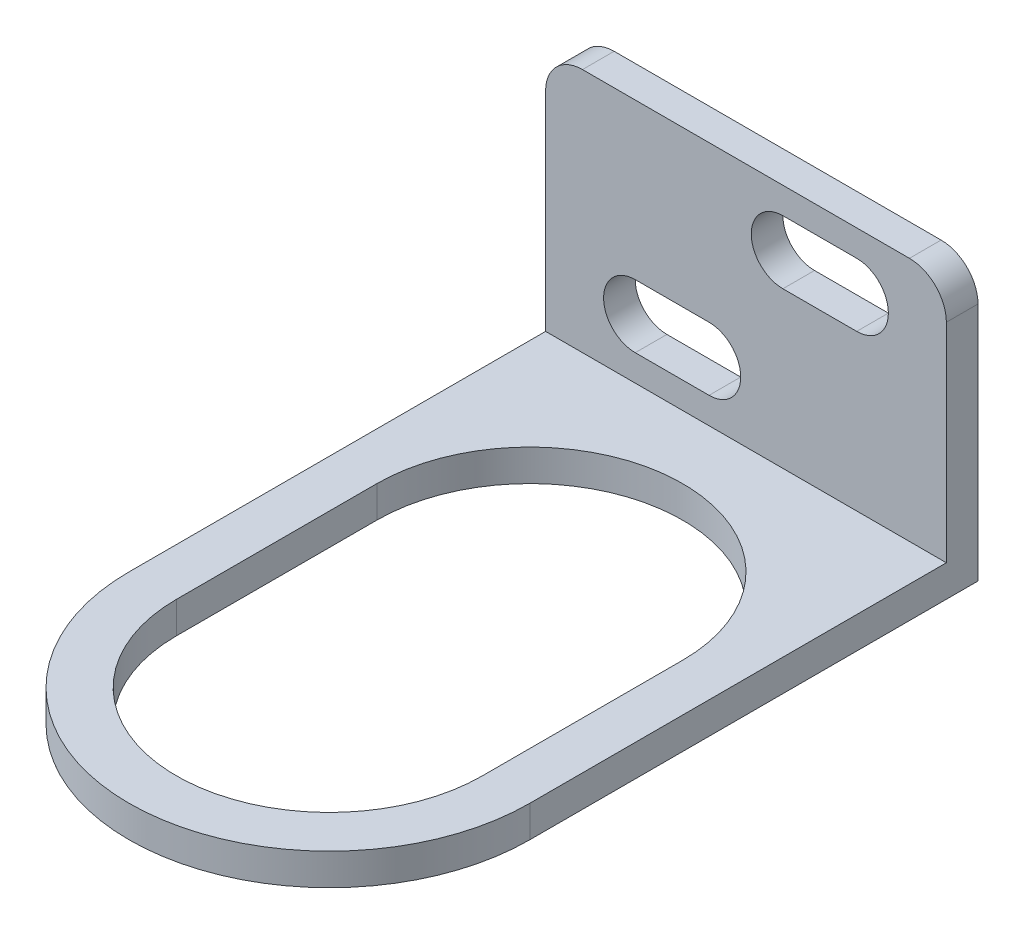
ISO-10303-21;
HEADER;
FILE_DESCRIPTION(('STEP AP214'),'2;1');
FILE_NAME('part.step','',(''),(''),'','','');
FILE_SCHEMA(('AUTOMOTIVE_DESIGN { 1 0 10303 214 1 1 1 1 }'));
ENDSEC;
DATA;
#1=APPLICATION_CONTEXT('core data for automotive mechanical design processes');
#2=APPLICATION_PROTOCOL_DEFINITION('international standard','automotive_design',2000,#1);
#3=PRODUCT_CONTEXT('',#1,'mechanical');
#4=PRODUCT('Part','Part','',(#3));
#5=PRODUCT_RELATED_PRODUCT_CATEGORY('part','',(#4));
#6=PRODUCT_DEFINITION_FORMATION('','',#4);
#7=PRODUCT_DEFINITION_CONTEXT('part definition',#1,'design');
#8=PRODUCT_DEFINITION('design','',#6,#7);
#9=PRODUCT_DEFINITION_SHAPE('','',#8);
#10=(LENGTH_UNIT() NAMED_UNIT(*) SI_UNIT(.MILLI.,.METRE.));
#11=(NAMED_UNIT(*) PLANE_ANGLE_UNIT() SI_UNIT($,.RADIAN.));
#12=(NAMED_UNIT(*) SI_UNIT($,.STERADIAN.) SOLID_ANGLE_UNIT());
#13=UNCERTAINTY_MEASURE_WITH_UNIT(LENGTH_MEASURE(1.E-05),#10,'distance_accuracy_value','');
#14=(GEOMETRIC_REPRESENTATION_CONTEXT(3) GLOBAL_UNCERTAINTY_ASSIGNED_CONTEXT((#13)) GLOBAL_UNIT_ASSIGNED_CONTEXT((#10,
#11,#12)) REPRESENTATION_CONTEXT('',''));
#15=CARTESIAN_POINT('',(0.,0.,0.));
#16=DIRECTION('',(0.,0.,1.));
#17=DIRECTION('',(1.,0.,0.));
#18=AXIS2_PLACEMENT_3D('',#15,#16,#17);
#19=CARTESIAN_POINT('',(-38.,0.,63.));
#20=DIRECTION('',(0.,-1.,0.));
#21=DIRECTION('',(0.,0.,-1.));
#22=AXIS2_PLACEMENT_3D('',#19,#20,#21);
#23=PLANE('',#22);
#24=DIRECTION('',(0.,0.,1.));
#25=VECTOR('',#24,1.);
#26=CARTESIAN_POINT('',(-33.5,0.,0.));
#27=LINE('',#26,#25);
#28=CARTESIAN_POINT('',(-33.5,0.,23.5));
#29=VERTEX_POINT('',#28);
#30=CARTESIAN_POINT('',(-33.5,0.,42.5));
#31=VERTEX_POINT('',#30);
#32=EDGE_CURVE('E348',#29,#31,#27,.T.);
#33=ORIENTED_EDGE('',*,*,#32,.T.);
#34=CARTESIAN_POINT('',(-19.,0.,42.5));
#35=DIRECTION('',(0.,1.,0.));
#36=DIRECTION('',(0.,0.,1.));
#37=AXIS2_PLACEMENT_3D('',#34,#35,#36);
#38=CIRCLE('',#37,14.5);
#39=CARTESIAN_POINT('',(-4.5,0.,42.5));
#40=VERTEX_POINT('',#39);
#41=EDGE_CURVE('E360',#31,#40,#38,.T.);
#42=ORIENTED_EDGE('',*,*,#41,.T.);
#43=DIRECTION('',(0.,0.,1.));
#44=VECTOR('',#43,1.);
#45=CARTESIAN_POINT('',(-4.5,0.,0.));
#46=LINE('',#45,#44);
#47=CARTESIAN_POINT('',(-4.5,0.,23.5));
#48=VERTEX_POINT('',#47);
#49=EDGE_CURVE('E358',#48,#40,#46,.T.);
#50=ORIENTED_EDGE('',*,*,#49,.F.);
#51=CARTESIAN_POINT('',(-19.,0.,23.5));
#52=DIRECTION('',(0.,1.,0.));
#53=DIRECTION('',(0.,0.,1.));
#54=AXIS2_PLACEMENT_3D('',#51,#52,#53);
#55=CIRCLE('',#54,14.5);
#56=EDGE_CURVE('E340',#48,#29,#55,.T.);
#57=ORIENTED_EDGE('',*,*,#56,.T.);
#58=EDGE_LOOP('',(#33,#42,#50,#57));
#59=FACE_BOUND('',#58,.T.);
#60=DIRECTION('',(0.,0.,-1.));
#61=VECTOR('',#60,1.);
#62=CARTESIAN_POINT('',(0.,0.,63.));
#63=LINE('',#62,#61);
#64=CARTESIAN_POINT('',(0.,0.,42.5));
#65=VERTEX_POINT('',#64);
#66=CARTESIAN_POINT('',(0.,0.,0.));
#67=VERTEX_POINT('',#66);
#68=EDGE_CURVE('E206',#65,#67,#63,.T.);
#69=ORIENTED_EDGE('',*,*,#68,.F.);
#70=CARTESIAN_POINT('',(-19.,0.,42.5));
#71=DIRECTION('',(0.,1.,0.));
#72=DIRECTION('',(0.,0.,1.));
#73=AXIS2_PLACEMENT_3D('',#70,#71,#72);
#74=CIRCLE('',#73,19.);
#75=CARTESIAN_POINT('',(-38.,0.,42.5));
#76=VERTEX_POINT('',#75);
#77=EDGE_CURVE('E72',#76,#65,#74,.T.);
#78=ORIENTED_EDGE('',*,*,#77,.F.);
#79=DIRECTION('',(0.,0.,-1.));
#80=VECTOR('',#79,1.);
#81=CARTESIAN_POINT('',(-38.,0.,63.));
#82=LINE('',#81,#80);
#83=CARTESIAN_POINT('',(-38.,0.,0.));
#84=VERTEX_POINT('',#83);
#85=EDGE_CURVE('E204',#76,#84,#82,.T.);
#86=ORIENTED_EDGE('',*,*,#85,.T.);
#87=DIRECTION('',(1.,0.,0.));
#88=VECTOR('',#87,1.);
#89=CARTESIAN_POINT('',(-38.,0.,0.));
#90=LINE('',#89,#88);
#91=EDGE_CURVE('E233',#84,#67,#90,.T.);
#92=ORIENTED_EDGE('',*,*,#91,.T.);
#93=EDGE_LOOP('',(#69,#78,#86,#92));
#94=FACE_BOUND('',#93,.T.);
#95=ADVANCED_FACE('F57',(#59,#94),#23,.T.);
#96=CARTESIAN_POINT('',(-38.,3.,63.));
#97=DIRECTION('',(0.,-1.,0.));
#98=DIRECTION('',(0.,0.,-1.));
#99=AXIS2_PLACEMENT_3D('',#96,#97,#98);
#100=PLANE('',#99);
#101=CARTESIAN_POINT('',(-19.,3.,42.5));
#102=DIRECTION('',(0.,1.,0.));
#103=DIRECTION('',(0.,0.,1.));
#104=AXIS2_PLACEMENT_3D('',#101,#102,#103);
#105=CIRCLE('',#104,14.5);
#106=CARTESIAN_POINT('',(-33.5,3.,42.5));
#107=VERTEX_POINT('',#106);
#108=CARTESIAN_POINT('',(-4.5,3.,42.5));
#109=VERTEX_POINT('',#108);
#110=EDGE_CURVE('E352',#107,#109,#105,.T.);
#111=ORIENTED_EDGE('',*,*,#110,.F.);
#112=DIRECTION('',(0.,0.,1.));
#113=VECTOR('',#112,1.);
#114=CARTESIAN_POINT('',(-33.5,3.,0.));
#115=LINE('',#114,#113);
#116=CARTESIAN_POINT('',(-33.5,3.,23.5));
#117=VERTEX_POINT('',#116);
#118=EDGE_CURVE('E354',#117,#107,#115,.T.);
#119=ORIENTED_EDGE('',*,*,#118,.F.);
#120=CARTESIAN_POINT('',(-19.,3.,23.5));
#121=DIRECTION('',(0.,1.,0.));
#122=DIRECTION('',(0.,0.,1.));
#123=AXIS2_PLACEMENT_3D('',#120,#121,#122);
#124=CIRCLE('',#123,14.5);
#125=CARTESIAN_POINT('',(-4.5,3.,23.5));
#126=VERTEX_POINT('',#125);
#127=EDGE_CURVE('E345',#126,#117,#124,.T.);
#128=ORIENTED_EDGE('',*,*,#127,.F.);
#129=DIRECTION('',(0.,0.,1.));
#130=VECTOR('',#129,1.);
#131=CARTESIAN_POINT('',(-4.5,3.,0.));
#132=LINE('',#131,#130);
#133=EDGE_CURVE('E349',#126,#109,#132,.T.);
#134=ORIENTED_EDGE('',*,*,#133,.T.);
#135=EDGE_LOOP('',(#111,#119,#128,#134));
#136=FACE_BOUND('',#135,.T.);
#137=CARTESIAN_POINT('',(-19.,3.,42.5));
#138=DIRECTION('',(0.,1.,0.));
#139=DIRECTION('',(0.,0.,1.));
#140=AXIS2_PLACEMENT_3D('',#137,#138,#139);
#141=CIRCLE('',#140,19.);
#142=CARTESIAN_POINT('',(-38.,3.,42.5));
#143=VERTEX_POINT('',#142);
#144=CARTESIAN_POINT('',(0.,3.,42.5));
#145=VERTEX_POINT('',#144);
#146=EDGE_CURVE('E195',#143,#145,#141,.T.);
#147=ORIENTED_EDGE('',*,*,#146,.T.);
#148=DIRECTION('',(0.,0.,-1.));
#149=VECTOR('',#148,1.);
#150=CARTESIAN_POINT('',(0.,3.,63.));
#151=LINE('',#150,#149);
#152=CARTESIAN_POINT('',(0.,3.,3.));
#153=VERTEX_POINT('',#152);
#154=EDGE_CURVE('E230',#145,#153,#151,.T.);
#155=ORIENTED_EDGE('',*,*,#154,.T.);
#156=DIRECTION('',(1.,0.,0.));
#157=VECTOR('',#156,1.);
#158=CARTESIAN_POINT('',(-38.,3.,3.));
#159=LINE('',#158,#157);
#160=CARTESIAN_POINT('',(-38.,3.,3.));
#161=VERTEX_POINT('',#160);
#162=EDGE_CURVE('E236',#161,#153,#159,.T.);
#163=ORIENTED_EDGE('',*,*,#162,.F.);
#164=DIRECTION('',(0.,0.,-1.));
#165=VECTOR('',#164,1.);
#166=CARTESIAN_POINT('',(-38.,3.,63.));
#167=LINE('',#166,#165);
#168=EDGE_CURVE('E214',#143,#161,#167,.T.);
#169=ORIENTED_EDGE('',*,*,#168,.F.);
#170=EDGE_LOOP('',(#147,#155,#163,#169));
#171=FACE_BOUND('',#170,.T.);
#172=ADVANCED_FACE('F368',(#136,#171),#100,.F.);
#173=CARTESIAN_POINT('',(-38.,0.,0.));
#174=DIRECTION('',(-1.,0.,0.));
#175=DIRECTION('',(0.,0.,1.));
#176=AXIS2_PLACEMENT_3D('',#173,#174,#175);
#177=PLANE('',#176);
#178=ORIENTED_EDGE('',*,*,#85,.F.);
#179=DIRECTION('',(0.,1.,0.));
#180=VECTOR('',#179,1.);
#181=CARTESIAN_POINT('',(-38.,0.,42.5));
#182=LINE('',#181,#180);
#183=EDGE_CURVE('E192',#76,#143,#182,.T.);
#184=ORIENTED_EDGE('',*,*,#183,.T.);
#185=ORIENTED_EDGE('',*,*,#168,.T.);
#186=DIRECTION('',(0.,1.,0.));
#187=VECTOR('',#186,1.);
#188=CARTESIAN_POINT('',(-38.,0.,3.));
#189=LINE('',#188,#187);
#190=CARTESIAN_POINT('',(-38.,22.75,3.));
#191=VERTEX_POINT('',#190);
#192=EDGE_CURVE('E219',#161,#191,#189,.T.);
#193=ORIENTED_EDGE('',*,*,#192,.T.);
#194=DIRECTION('',(0.,0.,-1.));
#195=VECTOR('',#194,1.);
#196=CARTESIAN_POINT('',(-38.,22.75,0.));
#197=LINE('',#196,#195);
#198=CARTESIAN_POINT('',(-38.,22.75,0.));
#199=VERTEX_POINT('',#198);
#200=EDGE_CURVE('E235',#191,#199,#197,.T.);
#201=ORIENTED_EDGE('',*,*,#200,.T.);
#202=DIRECTION('',(0.,1.,0.));
#203=VECTOR('',#202,1.);
#204=CARTESIAN_POINT('',(-38.,0.,0.));
#205=LINE('',#204,#203);
#206=EDGE_CURVE('E212',#84,#199,#205,.T.);
#207=ORIENTED_EDGE('',*,*,#206,.F.);
#208=EDGE_LOOP('',(#178,#184,#185,#193,#201,#207));
#209=FACE_BOUND('',#208,.T.);
#210=ADVANCED_FACE('F209',(#209),#177,.T.);
#211=CARTESIAN_POINT('',(0.,0.,0.));
#212=DIRECTION('',(-1.,0.,0.));
#213=DIRECTION('',(0.,0.,1.));
#214=AXIS2_PLACEMENT_3D('',#211,#212,#213);
#215=PLANE('',#214);
#216=DIRECTION('',(0.,1.,0.));
#217=VECTOR('',#216,1.);
#218=CARTESIAN_POINT('',(0.,0.,42.5));
#219=LINE('',#218,#217);
#220=EDGE_CURVE('E199',#65,#145,#219,.T.);
#221=ORIENTED_EDGE('',*,*,#220,.F.);
#222=ORIENTED_EDGE('',*,*,#68,.T.);
#223=DIRECTION('',(0.,1.,0.));
#224=VECTOR('',#223,1.);
#225=CARTESIAN_POINT('',(0.,0.,0.));
#226=LINE('',#225,#224);
#227=CARTESIAN_POINT('',(0.,22.75,0.));
#228=VERTEX_POINT('',#227);
#229=EDGE_CURVE('E223',#67,#228,#226,.T.);
#230=ORIENTED_EDGE('',*,*,#229,.T.);
#231=DIRECTION('',(0.,0.,-1.));
#232=VECTOR('',#231,1.);
#233=CARTESIAN_POINT('',(0.,22.75,0.));
#234=LINE('',#233,#232);
#235=CARTESIAN_POINT('',(0.,22.75,3.));
#236=VERTEX_POINT('',#235);
#237=EDGE_CURVE('E252',#228,#236,#234,.F.);
#238=ORIENTED_EDGE('',*,*,#237,.T.);
#239=DIRECTION('',(0.,1.,0.));
#240=VECTOR('',#239,1.);
#241=CARTESIAN_POINT('',(0.,0.,3.));
#242=LINE('',#241,#240);
#243=EDGE_CURVE('E226',#153,#236,#242,.T.);
#244=ORIENTED_EDGE('',*,*,#243,.F.);
#245=ORIENTED_EDGE('',*,*,#154,.F.);
#246=EDGE_LOOP('',(#221,#222,#230,#238,#244,#245));
#247=FACE_BOUND('',#246,.T.);
#248=ADVANCED_FACE('F370',(#247),#215,.F.);
#249=CARTESIAN_POINT('',(-3.5,22.75,3.));
#250=DIRECTION('',(0.,0.,-1.));
#251=DIRECTION('',(-1.,0.,0.));
#252=AXIS2_PLACEMENT_3D('',#249,#250,#251);
#253=CYLINDRICAL_SURFACE('',#252,3.5);
#254=DIRECTION('',(0.,0.,-1.));
#255=VECTOR('',#254,1.);
#256=CARTESIAN_POINT('',(-3.5,26.25,3.));
#257=LINE('',#256,#255);
#258=CARTESIAN_POINT('',(-3.5,26.25,3.));
#259=VERTEX_POINT('',#258);
#260=CARTESIAN_POINT('',(-3.5,26.25,0.));
#261=VERTEX_POINT('',#260);
#262=EDGE_CURVE('E249',#259,#261,#257,.T.);
#263=ORIENTED_EDGE('',*,*,#262,.F.);
#264=CARTESIAN_POINT('',(-3.5,22.75,3.));
#265=DIRECTION('',(0.,0.,-1.));
#266=DIRECTION('',(-1.,0.,0.));
#267=AXIS2_PLACEMENT_3D('',#264,#265,#266);
#268=CIRCLE('',#267,3.5);
#269=EDGE_CURVE('E65',#236,#259,#268,.F.);
#270=ORIENTED_EDGE('',*,*,#269,.F.);
#271=ORIENTED_EDGE('',*,*,#237,.F.);
#272=CARTESIAN_POINT('',(-3.5,22.75,0.));
#273=DIRECTION('',(0.,0.,-1.));
#274=DIRECTION('',(-1.,0.,0.));
#275=AXIS2_PLACEMENT_3D('',#272,#273,#274);
#276=CIRCLE('',#275,3.5);
#277=EDGE_CURVE('E12',#261,#228,#276,.T.);
#278=ORIENTED_EDGE('',*,*,#277,.F.);
#279=EDGE_LOOP('',(#263,#270,#271,#278));
#280=FACE_BOUND('',#279,.T.);
#281=ADVANCED_FACE('F59',(#280),#253,.T.);
#282=CARTESIAN_POINT('',(-34.5,22.75,0.));
#283=DIRECTION('',(0.,0.,1.));
#284=DIRECTION('',(1.,0.,0.));
#285=AXIS2_PLACEMENT_3D('',#282,#283,#284);
#286=CYLINDRICAL_SURFACE('',#285,3.5);
#287=ORIENTED_EDGE('',*,*,#200,.F.);
#288=CARTESIAN_POINT('',(-34.5,22.75,3.));
#289=DIRECTION('',(0.,0.,-1.));
#290=DIRECTION('',(-1.,0.,0.));
#291=AXIS2_PLACEMENT_3D('',#288,#289,#290);
#292=CIRCLE('',#291,3.5);
#293=CARTESIAN_POINT('',(-34.5,26.25,3.));
#294=VERTEX_POINT('',#293);
#295=EDGE_CURVE('E245',#294,#191,#292,.F.);
#296=ORIENTED_EDGE('',*,*,#295,.F.);
#297=DIRECTION('',(0.,0.,-1.));
#298=VECTOR('',#297,1.);
#299=CARTESIAN_POINT('',(-34.5,26.25,0.));
#300=LINE('',#299,#298);
#301=CARTESIAN_POINT('',(-34.5,26.25,0.));
#302=VERTEX_POINT('',#301);
#303=EDGE_CURVE('E242',#302,#294,#300,.F.);
#304=ORIENTED_EDGE('',*,*,#303,.F.);
#305=CARTESIAN_POINT('',(-34.5,22.75,0.));
#306=DIRECTION('',(0.,0.,-1.));
#307=DIRECTION('',(-1.,0.,0.));
#308=AXIS2_PLACEMENT_3D('',#305,#306,#307);
#309=CIRCLE('',#308,3.5);
#310=EDGE_CURVE('E247',#199,#302,#309,.T.);
#311=ORIENTED_EDGE('',*,*,#310,.F.);
#312=EDGE_LOOP('',(#287,#296,#304,#311));
#313=FACE_BOUND('',#312,.T.);
#314=ADVANCED_FACE('F267',(#313),#286,.T.);
#315=CARTESIAN_POINT('',(-38.,0.,0.));
#316=DIRECTION('',(0.,0.,-1.));
#317=DIRECTION('',(-1.,0.,0.));
#318=AXIS2_PLACEMENT_3D('',#315,#316,#317);
#319=PLANE('',#318);
#320=CARTESIAN_POINT('',(-15.5,20.75,0.));
#321=DIRECTION('',(0.,0.,1.));
#322=DIRECTION('',(1.,0.,0.));
#323=AXIS2_PLACEMENT_3D('',#320,#321,#322);
#324=CIRCLE('',#323,3.);
#325=CARTESIAN_POINT('',(-15.5,23.75,0.));
#326=VERTEX_POINT('',#325);
#327=CARTESIAN_POINT('',(-15.5,17.75,0.));
#328=VERTEX_POINT('',#327);
#329=EDGE_CURVE('E317',#326,#328,#324,.T.);
#330=ORIENTED_EDGE('',*,*,#329,.T.);
#331=DIRECTION('',(1.,0.,0.));
#332=VECTOR('',#331,1.);
#333=CARTESIAN_POINT('',(-15.5,17.75,0.));
#334=LINE('',#333,#332);
#335=CARTESIAN_POINT('',(-8.5,17.75,0.));
#336=VERTEX_POINT('',#335);
#337=EDGE_CURVE('E332',#328,#336,#334,.T.);
#338=ORIENTED_EDGE('',*,*,#337,.T.);
#339=CARTESIAN_POINT('',(-8.5,20.75,0.));
#340=DIRECTION('',(0.,0.,1.));
#341=DIRECTION('',(1.,0.,0.));
#342=AXIS2_PLACEMENT_3D('',#339,#340,#341);
#343=CIRCLE('',#342,3.);
#344=CARTESIAN_POINT('',(-8.5,23.75,0.));
#345=VERTEX_POINT('',#344);
#346=EDGE_CURVE('E329',#336,#345,#343,.T.);
#347=ORIENTED_EDGE('',*,*,#346,.T.);
#348=DIRECTION('',(-1.,0.,0.));
#349=VECTOR('',#348,1.);
#350=CARTESIAN_POINT('',(-15.5,23.75,0.));
#351=LINE('',#350,#349);
#352=EDGE_CURVE('E309',#345,#326,#351,.T.);
#353=ORIENTED_EDGE('',*,*,#352,.T.);
#354=EDGE_LOOP('',(#330,#338,#347,#353));
#355=FACE_BOUND('',#354,.T.);
#356=CARTESIAN_POINT('',(-29.5,8.5,0.));
#357=DIRECTION('',(0.,0.,1.));
#358=DIRECTION('',(1.,0.,0.));
#359=AXIS2_PLACEMENT_3D('',#356,#357,#358);
#360=CIRCLE('',#359,3.);
#361=CARTESIAN_POINT('',(-29.5,11.5,0.));
#362=VERTEX_POINT('',#361);
#363=CARTESIAN_POINT('',(-29.5,5.5,0.));
#364=VERTEX_POINT('',#363);
#365=EDGE_CURVE('E285',#362,#364,#360,.T.);
#366=ORIENTED_EDGE('',*,*,#365,.T.);
#367=DIRECTION('',(1.,0.,0.));
#368=VECTOR('',#367,1.);
#369=CARTESIAN_POINT('',(-29.5,5.5,0.));
#370=LINE('',#369,#368);
#371=CARTESIAN_POINT('',(-22.5,5.5,0.));
#372=VERTEX_POINT('',#371);
#373=EDGE_CURVE('E300',#364,#372,#370,.T.);
#374=ORIENTED_EDGE('',*,*,#373,.T.);
#375=CARTESIAN_POINT('',(-22.5,8.5,0.));
#376=DIRECTION('',(0.,0.,1.));
#377=DIRECTION('',(1.,0.,0.));
#378=AXIS2_PLACEMENT_3D('',#375,#376,#377);
#379=CIRCLE('',#378,3.);
#380=CARTESIAN_POINT('',(-22.5,11.5,0.));
#381=VERTEX_POINT('',#380);
#382=EDGE_CURVE('E297',#372,#381,#379,.T.);
#383=ORIENTED_EDGE('',*,*,#382,.T.);
#384=DIRECTION('',(-1.,0.,0.));
#385=VECTOR('',#384,1.);
#386=CARTESIAN_POINT('',(-29.5,11.5,0.));
#387=LINE('',#386,#385);
#388=EDGE_CURVE('E277',#381,#362,#387,.T.);
#389=ORIENTED_EDGE('',*,*,#388,.T.);
#390=EDGE_LOOP('',(#366,#374,#383,#389));
#391=FACE_BOUND('',#390,.T.);
#392=DIRECTION('',(1.,0.,0.));
#393=VECTOR('',#392,1.);
#394=CARTESIAN_POINT('',(-38.,26.25,0.));
#395=LINE('',#394,#393);
#396=EDGE_CURVE('E213',#302,#261,#395,.T.);
#397=ORIENTED_EDGE('',*,*,#396,.T.);
#398=ORIENTED_EDGE('',*,*,#277,.T.);
#399=ORIENTED_EDGE('',*,*,#229,.F.);
#400=ORIENTED_EDGE('',*,*,#91,.F.);
#401=ORIENTED_EDGE('',*,*,#206,.T.);
#402=ORIENTED_EDGE('',*,*,#310,.T.);
#403=EDGE_LOOP('',(#397,#398,#399,#400,#401,#402));
#404=FACE_BOUND('',#403,.T.);
#405=ADVANCED_FACE('F373',(#355,#391,#404),#319,.T.);
#406=CARTESIAN_POINT('',(-38.,0.,3.));
#407=DIRECTION('',(0.,0.,-1.));
#408=DIRECTION('',(-1.,0.,0.));
#409=AXIS2_PLACEMENT_3D('',#406,#407,#408);
#410=PLANE('',#409);
#411=DIRECTION('',(1.,0.,0.));
#412=VECTOR('',#411,1.);
#413=CARTESIAN_POINT('',(-15.5,17.75,3.));
#414=LINE('',#413,#412);
#415=CARTESIAN_POINT('',(-15.5,17.75,3.));
#416=VERTEX_POINT('',#415);
#417=CARTESIAN_POINT('',(-8.5,17.75,3.));
#418=VERTEX_POINT('',#417);
#419=EDGE_CURVE('E321',#416,#418,#414,.T.);
#420=ORIENTED_EDGE('',*,*,#419,.F.);
#421=CARTESIAN_POINT('',(-15.5,20.75,3.));
#422=DIRECTION('',(0.,0.,1.));
#423=DIRECTION('',(1.,0.,0.));
#424=AXIS2_PLACEMENT_3D('',#421,#422,#423);
#425=CIRCLE('',#424,3.);
#426=CARTESIAN_POINT('',(-15.5,23.75,3.));
#427=VERTEX_POINT('',#426);
#428=EDGE_CURVE('E324',#427,#416,#425,.T.);
#429=ORIENTED_EDGE('',*,*,#428,.F.);
#430=DIRECTION('',(-1.,0.,0.));
#431=VECTOR('',#430,1.);
#432=CARTESIAN_POINT('',(-15.5,23.75,3.));
#433=LINE('',#432,#431);
#434=CARTESIAN_POINT('',(-8.5,23.75,3.));
#435=VERTEX_POINT('',#434);
#436=EDGE_CURVE('E314',#435,#427,#433,.T.);
#437=ORIENTED_EDGE('',*,*,#436,.F.);
#438=CARTESIAN_POINT('',(-8.5,20.75,3.));
#439=DIRECTION('',(0.,0.,1.));
#440=DIRECTION('',(1.,0.,0.));
#441=AXIS2_PLACEMENT_3D('',#438,#439,#440);
#442=CIRCLE('',#441,3.);
#443=EDGE_CURVE('E318',#418,#435,#442,.T.);
#444=ORIENTED_EDGE('',*,*,#443,.F.);
#445=EDGE_LOOP('',(#420,#429,#437,#444));
#446=FACE_BOUND('',#445,.T.);
#447=DIRECTION('',(1.,0.,0.));
#448=VECTOR('',#447,1.);
#449=CARTESIAN_POINT('',(-29.5,5.5,3.));
#450=LINE('',#449,#448);
#451=CARTESIAN_POINT('',(-29.5,5.5,3.));
#452=VERTEX_POINT('',#451);
#453=CARTESIAN_POINT('',(-22.5,5.5,3.));
#454=VERTEX_POINT('',#453);
#455=EDGE_CURVE('E289',#452,#454,#450,.T.);
#456=ORIENTED_EDGE('',*,*,#455,.F.);
#457=CARTESIAN_POINT('',(-29.5,8.5,3.));
#458=DIRECTION('',(0.,0.,1.));
#459=DIRECTION('',(1.,0.,0.));
#460=AXIS2_PLACEMENT_3D('',#457,#458,#459);
#461=CIRCLE('',#460,3.);
#462=CARTESIAN_POINT('',(-29.5,11.5,3.));
#463=VERTEX_POINT('',#462);
#464=EDGE_CURVE('E292',#463,#452,#461,.T.);
#465=ORIENTED_EDGE('',*,*,#464,.F.);
#466=DIRECTION('',(-1.,0.,0.));
#467=VECTOR('',#466,1.);
#468=CARTESIAN_POINT('',(-29.5,11.5,3.));
#469=LINE('',#468,#467);
#470=CARTESIAN_POINT('',(-22.5,11.5,3.));
#471=VERTEX_POINT('',#470);
#472=EDGE_CURVE('E282',#471,#463,#469,.T.);
#473=ORIENTED_EDGE('',*,*,#472,.F.);
#474=CARTESIAN_POINT('',(-22.5,8.5,3.));
#475=DIRECTION('',(0.,0.,1.));
#476=DIRECTION('',(1.,0.,0.));
#477=AXIS2_PLACEMENT_3D('',#474,#475,#476);
#478=CIRCLE('',#477,3.);
#479=EDGE_CURVE('E286',#454,#471,#478,.T.);
#480=ORIENTED_EDGE('',*,*,#479,.F.);
#481=EDGE_LOOP('',(#456,#465,#473,#480));
#482=FACE_BOUND('',#481,.T.);
#483=ORIENTED_EDGE('',*,*,#243,.T.);
#484=ORIENTED_EDGE('',*,*,#269,.T.);
#485=DIRECTION('',(1.,0.,0.));
#486=VECTOR('',#485,1.);
#487=CARTESIAN_POINT('',(-38.,26.25,3.));
#488=LINE('',#487,#486);
#489=EDGE_CURVE('E217',#294,#259,#488,.T.);
#490=ORIENTED_EDGE('',*,*,#489,.F.);
#491=ORIENTED_EDGE('',*,*,#295,.T.);
#492=ORIENTED_EDGE('',*,*,#192,.F.);
#493=ORIENTED_EDGE('',*,*,#162,.T.);
#494=EDGE_LOOP('',(#483,#484,#490,#491,#492,#493));
#495=FACE_BOUND('',#494,.T.);
#496=ADVANCED_FACE('F257',(#446,#482,#495),#410,.F.);
#497=CARTESIAN_POINT('',(-38.,26.25,3.));
#498=DIRECTION('',(0.,-1.,0.));
#499=DIRECTION('',(0.,0.,-1.));
#500=AXIS2_PLACEMENT_3D('',#497,#498,#499);
#501=PLANE('',#500);
#502=ORIENTED_EDGE('',*,*,#489,.T.);
#503=ORIENTED_EDGE('',*,*,#262,.T.);
#504=ORIENTED_EDGE('',*,*,#396,.F.);
#505=ORIENTED_EDGE('',*,*,#303,.T.);
#506=EDGE_LOOP('',(#502,#503,#504,#505));
#507=FACE_BOUND('',#506,.T.);
#508=ADVANCED_FACE('F263',(#507),#501,.F.);
#509=CARTESIAN_POINT('',(-29.5,8.5,0.));
#510=DIRECTION('',(0.,0.,1.));
#511=DIRECTION('',(1.,0.,0.));
#512=AXIS2_PLACEMENT_3D('',#509,#510,#511);
#513=CYLINDRICAL_SURFACE('',#512,3.);
#514=ORIENTED_EDGE('',*,*,#464,.T.);
#515=DIRECTION('',(0.,0.,1.));
#516=VECTOR('',#515,1.);
#517=CARTESIAN_POINT('',(-29.5,5.5,0.));
#518=LINE('',#517,#516);
#519=EDGE_CURVE('E273',#364,#452,#518,.T.);
#520=ORIENTED_EDGE('',*,*,#519,.F.);
#521=ORIENTED_EDGE('',*,*,#365,.F.);
#522=DIRECTION('',(0.,0.,1.));
#523=VECTOR('',#522,1.);
#524=CARTESIAN_POINT('',(-29.5,11.5,0.));
#525=LINE('',#524,#523);
#526=EDGE_CURVE('E227',#362,#463,#525,.T.);
#527=ORIENTED_EDGE('',*,*,#526,.T.);
#528=EDGE_LOOP('',(#514,#520,#521,#527));
#529=FACE_BOUND('',#528,.T.);
#530=ADVANCED_FACE('F396',(#529),#513,.F.);
#531=CARTESIAN_POINT('',(-29.5,11.5,0.));
#532=DIRECTION('',(0.,1.,0.));
#533=DIRECTION('',(-1.,0.,0.));
#534=AXIS2_PLACEMENT_3D('',#531,#532,#533);
#535=PLANE('',#534);
#536=ORIENTED_EDGE('',*,*,#472,.T.);
#537=ORIENTED_EDGE('',*,*,#526,.F.);
#538=ORIENTED_EDGE('',*,*,#388,.F.);
#539=DIRECTION('',(0.,0.,1.));
#540=VECTOR('',#539,1.);
#541=CARTESIAN_POINT('',(-22.5,11.5,0.));
#542=LINE('',#541,#540);
#543=EDGE_CURVE('E279',#381,#471,#542,.T.);
#544=ORIENTED_EDGE('',*,*,#543,.T.);
#545=EDGE_LOOP('',(#536,#537,#538,#544));
#546=FACE_BOUND('',#545,.T.);
#547=ADVANCED_FACE('F400',(#546),#535,.F.);
#548=CARTESIAN_POINT('',(-22.5,8.5,0.));
#549=DIRECTION('',(0.,0.,1.));
#550=DIRECTION('',(1.,0.,0.));
#551=AXIS2_PLACEMENT_3D('',#548,#549,#550);
#552=CYLINDRICAL_SURFACE('',#551,3.);
#553=ORIENTED_EDGE('',*,*,#479,.T.);
#554=ORIENTED_EDGE('',*,*,#543,.F.);
#555=ORIENTED_EDGE('',*,*,#382,.F.);
#556=DIRECTION('',(0.,0.,1.));
#557=VECTOR('',#556,1.);
#558=CARTESIAN_POINT('',(-22.5,5.5,0.));
#559=LINE('',#558,#557);
#560=EDGE_CURVE('E276',#372,#454,#559,.T.);
#561=ORIENTED_EDGE('',*,*,#560,.T.);
#562=EDGE_LOOP('',(#553,#554,#555,#561));
#563=FACE_BOUND('',#562,.T.);
#564=ADVANCED_FACE('F406',(#563),#552,.F.);
#565=CARTESIAN_POINT('',(-29.5,5.5,0.));
#566=DIRECTION('',(0.,-1.,0.));
#567=DIRECTION('',(1.,0.,0.));
#568=AXIS2_PLACEMENT_3D('',#565,#566,#567);
#569=PLANE('',#568);
#570=ORIENTED_EDGE('',*,*,#455,.T.);
#571=ORIENTED_EDGE('',*,*,#560,.F.);
#572=ORIENTED_EDGE('',*,*,#373,.F.);
#573=ORIENTED_EDGE('',*,*,#519,.T.);
#574=EDGE_LOOP('',(#570,#571,#572,#573));
#575=FACE_BOUND('',#574,.T.);
#576=ADVANCED_FACE('F410',(#575),#569,.F.);
#577=CARTESIAN_POINT('',(-15.5,20.75,0.));
#578=DIRECTION('',(0.,0.,1.));
#579=DIRECTION('',(1.,0.,0.));
#580=AXIS2_PLACEMENT_3D('',#577,#578,#579);
#581=CYLINDRICAL_SURFACE('',#580,3.);
#582=ORIENTED_EDGE('',*,*,#428,.T.);
#583=DIRECTION('',(0.,0.,1.));
#584=VECTOR('',#583,1.);
#585=CARTESIAN_POINT('',(-15.5,17.75,0.));
#586=LINE('',#585,#584);
#587=EDGE_CURVE('E305',#328,#416,#586,.T.);
#588=ORIENTED_EDGE('',*,*,#587,.F.);
#589=ORIENTED_EDGE('',*,*,#329,.F.);
#590=DIRECTION('',(0.,0.,1.));
#591=VECTOR('',#590,1.);
#592=CARTESIAN_POINT('',(-15.5,23.75,0.));
#593=LINE('',#592,#591);
#594=EDGE_CURVE('E294',#326,#427,#593,.T.);
#595=ORIENTED_EDGE('',*,*,#594,.T.);
#596=EDGE_LOOP('',(#582,#588,#589,#595));
#597=FACE_BOUND('',#596,.T.);
#598=ADVANCED_FACE('F457',(#597),#581,.F.);
#599=CARTESIAN_POINT('',(-15.5,23.75,0.));
#600=DIRECTION('',(0.,1.,0.));
#601=DIRECTION('',(-1.,0.,0.));
#602=AXIS2_PLACEMENT_3D('',#599,#600,#601);
#603=PLANE('',#602);
#604=ORIENTED_EDGE('',*,*,#436,.T.);
#605=ORIENTED_EDGE('',*,*,#594,.F.);
#606=ORIENTED_EDGE('',*,*,#352,.F.);
#607=DIRECTION('',(0.,0.,1.));
#608=VECTOR('',#607,1.);
#609=CARTESIAN_POINT('',(-8.5,23.75,0.));
#610=LINE('',#609,#608);
#611=EDGE_CURVE('E311',#345,#435,#610,.T.);
#612=ORIENTED_EDGE('',*,*,#611,.T.);
#613=EDGE_LOOP('',(#604,#605,#606,#612));
#614=FACE_BOUND('',#613,.T.);
#615=ADVANCED_FACE('F447',(#614),#603,.F.);
#616=CARTESIAN_POINT('',(-8.5,20.75,0.));
#617=DIRECTION('',(0.,0.,1.));
#618=DIRECTION('',(1.,0.,0.));
#619=AXIS2_PLACEMENT_3D('',#616,#617,#618);
#620=CYLINDRICAL_SURFACE('',#619,3.);
#621=ORIENTED_EDGE('',*,*,#443,.T.);
#622=ORIENTED_EDGE('',*,*,#611,.F.);
#623=ORIENTED_EDGE('',*,*,#346,.F.);
#624=DIRECTION('',(0.,0.,1.));
#625=VECTOR('',#624,1.);
#626=CARTESIAN_POINT('',(-8.5,17.75,0.));
#627=LINE('',#626,#625);
#628=EDGE_CURVE('E308',#336,#418,#627,.T.);
#629=ORIENTED_EDGE('',*,*,#628,.T.);
#630=EDGE_LOOP('',(#621,#622,#623,#629));
#631=FACE_BOUND('',#630,.T.);
#632=ADVANCED_FACE('F436',(#631),#620,.F.);
#633=CARTESIAN_POINT('',(-15.5,17.75,0.));
#634=DIRECTION('',(0.,-1.,0.));
#635=DIRECTION('',(0.,0.,-1.));
#636=AXIS2_PLACEMENT_3D('',#633,#634,#635);
#637=PLANE('',#636);
#638=ORIENTED_EDGE('',*,*,#419,.T.);
#639=ORIENTED_EDGE('',*,*,#628,.F.);
#640=ORIENTED_EDGE('',*,*,#337,.F.);
#641=ORIENTED_EDGE('',*,*,#587,.T.);
#642=EDGE_LOOP('',(#638,#639,#640,#641));
#643=FACE_BOUND('',#642,.T.);
#644=ADVANCED_FACE('F431',(#643),#637,.F.);
#645=CARTESIAN_POINT('',(-33.5,0.,0.));
#646=DIRECTION('',(-1.,0.,0.));
#647=DIRECTION('',(0.,0.,1.));
#648=AXIS2_PLACEMENT_3D('',#645,#646,#647);
#649=PLANE('',#648);
#650=ORIENTED_EDGE('',*,*,#118,.T.);
#651=DIRECTION('',(0.,1.,0.));
#652=VECTOR('',#651,1.);
#653=CARTESIAN_POINT('',(-33.5,0.,42.5));
#654=LINE('',#653,#652);
#655=EDGE_CURVE('E337',#31,#107,#654,.T.);
#656=ORIENTED_EDGE('',*,*,#655,.F.);
#657=ORIENTED_EDGE('',*,*,#32,.F.);
#658=DIRECTION('',(0.,1.,0.));
#659=VECTOR('',#658,1.);
#660=CARTESIAN_POINT('',(-33.5,0.,23.5));
#661=LINE('',#660,#659);
#662=EDGE_CURVE('E326',#29,#117,#661,.T.);
#663=ORIENTED_EDGE('',*,*,#662,.T.);
#664=EDGE_LOOP('',(#650,#656,#657,#663));
#665=FACE_BOUND('',#664,.T.);
#666=ADVANCED_FACE('F435',(#665),#649,.F.);
#667=CARTESIAN_POINT('',(-19.,0.,23.5));
#668=DIRECTION('',(0.,1.,0.));
#669=DIRECTION('',(0.,0.,1.));
#670=AXIS2_PLACEMENT_3D('',#667,#668,#669);
#671=CYLINDRICAL_SURFACE('',#670,14.5);
#672=ORIENTED_EDGE('',*,*,#127,.T.);
#673=ORIENTED_EDGE('',*,*,#662,.F.);
#674=ORIENTED_EDGE('',*,*,#56,.F.);
#675=DIRECTION('',(0.,1.,0.));
#676=VECTOR('',#675,1.);
#677=CARTESIAN_POINT('',(-4.5,0.,23.5));
#678=LINE('',#677,#676);
#679=EDGE_CURVE('E342',#48,#126,#678,.T.);
#680=ORIENTED_EDGE('',*,*,#679,.T.);
#681=EDGE_LOOP('',(#672,#673,#674,#680));
#682=FACE_BOUND('',#681,.T.);
#683=ADVANCED_FACE('F533',(#682),#671,.F.);
#684=CARTESIAN_POINT('',(-4.5,0.,0.));
#685=DIRECTION('',(-1.,0.,0.));
#686=DIRECTION('',(0.,0.,1.));
#687=AXIS2_PLACEMENT_3D('',#684,#685,#686);
#688=PLANE('',#687);
#689=ORIENTED_EDGE('',*,*,#133,.F.);
#690=ORIENTED_EDGE('',*,*,#679,.F.);
#691=ORIENTED_EDGE('',*,*,#49,.T.);
#692=DIRECTION('',(0.,1.,0.));
#693=VECTOR('',#692,1.);
#694=CARTESIAN_POINT('',(-4.5,0.,42.5));
#695=LINE('',#694,#693);
#696=EDGE_CURVE('E80',#40,#109,#695,.T.);
#697=ORIENTED_EDGE('',*,*,#696,.T.);
#698=EDGE_LOOP('',(#689,#690,#691,#697));
#699=FACE_BOUND('',#698,.T.);
#700=ADVANCED_FACE('F543',(#699),#688,.T.);
#701=CARTESIAN_POINT('',(-19.,0.,42.5));
#702=DIRECTION('',(0.,1.,0.));
#703=DIRECTION('',(0.,0.,1.));
#704=AXIS2_PLACEMENT_3D('',#701,#702,#703);
#705=CYLINDRICAL_SURFACE('',#704,14.5);
#706=ORIENTED_EDGE('',*,*,#110,.T.);
#707=ORIENTED_EDGE('',*,*,#696,.F.);
#708=ORIENTED_EDGE('',*,*,#41,.F.);
#709=ORIENTED_EDGE('',*,*,#655,.T.);
#710=EDGE_LOOP('',(#706,#707,#708,#709));
#711=FACE_BOUND('',#710,.T.);
#712=ADVANCED_FACE('F553',(#711),#705,.F.);
#713=CARTESIAN_POINT('',(-19.,0.,42.5));
#714=DIRECTION('',(0.,1.,0.));
#715=DIRECTION('',(0.,0.,1.));
#716=AXIS2_PLACEMENT_3D('',#713,#714,#715);
#717=CYLINDRICAL_SURFACE('',#716,19.);
#718=ORIENTED_EDGE('',*,*,#146,.F.);
#719=ORIENTED_EDGE('',*,*,#183,.F.);
#720=ORIENTED_EDGE('',*,*,#77,.T.);
#721=ORIENTED_EDGE('',*,*,#220,.T.);
#722=EDGE_LOOP('',(#718,#719,#720,#721));
#723=FACE_BOUND('',#722,.T.);
#724=ADVANCED_FACE('F193',(#723),#717,.T.);
#725=CLOSED_SHELL('',(#95,#172,#210,#248,#281,#314,#405,#496,#508,#530,#547,#564,#576,#598,#615,
#632,#644,#666,#683,#700,#712,#724));
#726=MANIFOLD_SOLID_BREP('B2',#725);
#727=ADVANCED_BREP_SHAPE_REPRESENTATION('',(#18,#726),#14);
#728=SHAPE_DEFINITION_REPRESENTATION(#9,#727);
ENDSEC;
END-ISO-10303-21;
